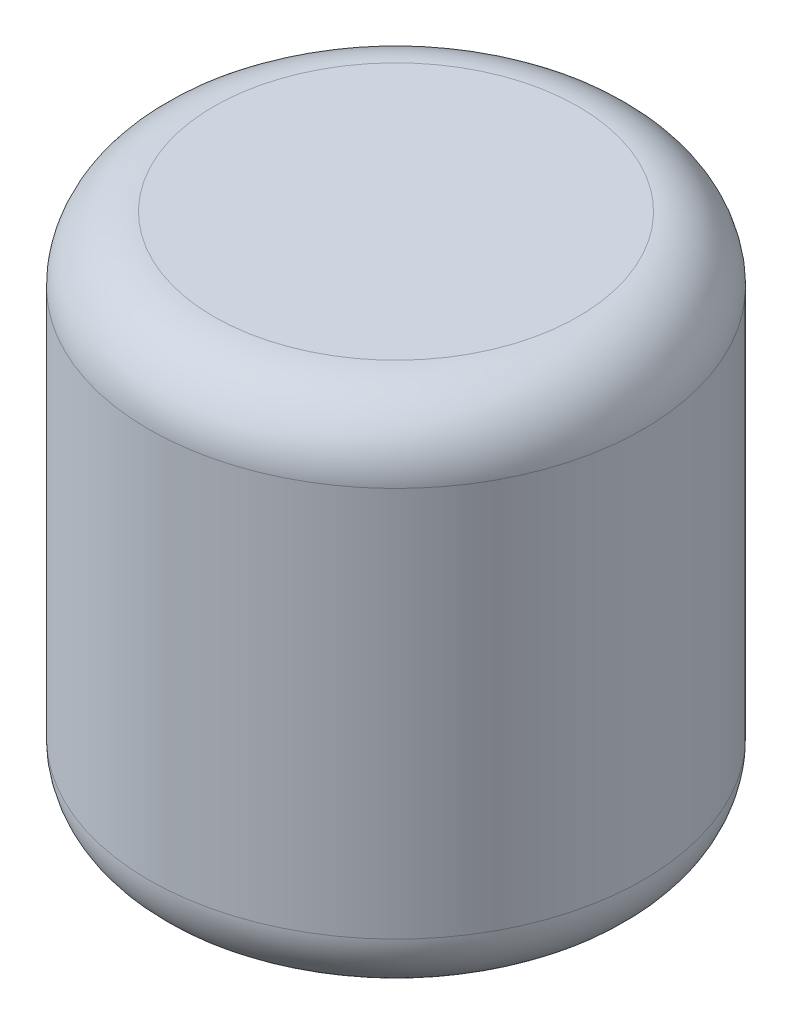
ISO-10303-21;
HEADER;
FILE_DESCRIPTION(('STEP AP214'),'2;1');
FILE_NAME('part.step','',(''),(''),'','','');
FILE_SCHEMA(('AUTOMOTIVE_DESIGN { 1 0 10303 214 1 1 1 1 }'));
ENDSEC;
DATA;
#1=APPLICATION_CONTEXT('core data for automotive mechanical design processes');
#2=APPLICATION_PROTOCOL_DEFINITION('international standard','automotive_design',2000,#1);
#3=PRODUCT_CONTEXT('',#1,'mechanical');
#4=PRODUCT('Part','Part','',(#3));
#5=PRODUCT_RELATED_PRODUCT_CATEGORY('part','',(#4));
#6=PRODUCT_DEFINITION_FORMATION('','',#4);
#7=PRODUCT_DEFINITION_CONTEXT('part definition',#1,'design');
#8=PRODUCT_DEFINITION('design','',#6,#7);
#9=PRODUCT_DEFINITION_SHAPE('','',#8);
#10=(LENGTH_UNIT() NAMED_UNIT(*) SI_UNIT(.MILLI.,.METRE.));
#11=(NAMED_UNIT(*) PLANE_ANGLE_UNIT() SI_UNIT($,.RADIAN.));
#12=(NAMED_UNIT(*) SI_UNIT($,.STERADIAN.) SOLID_ANGLE_UNIT());
#13=UNCERTAINTY_MEASURE_WITH_UNIT(LENGTH_MEASURE(1.E-05),#10,'distance_accuracy_value','');
#14=(GEOMETRIC_REPRESENTATION_CONTEXT(3) GLOBAL_UNCERTAINTY_ASSIGNED_CONTEXT((#13)) GLOBAL_UNIT_ASSIGNED_CONTEXT((#10,
#11,#12)) REPRESENTATION_CONTEXT('',''));
#15=CARTESIAN_POINT('',(0.,0.,0.));
#16=DIRECTION('',(0.,0.,1.));
#17=DIRECTION('',(1.,0.,0.));
#18=AXIS2_PLACEMENT_3D('',#15,#16,#17);
#19=CARTESIAN_POINT('',(0.,4.,0.));
#20=DIRECTION('',(0.,-1.,0.));
#21=DIRECTION('',(0.,0.,-1.));
#22=AXIS2_PLACEMENT_3D('',#19,#20,#21);
#23=CYLINDRICAL_SURFACE('',#22,1.9);
#24=CARTESIAN_POINT('',(0.,0.5,0.));
#25=DIRECTION('',(0.,1.,0.));
#26=DIRECTION('',(0.,0.,1.));
#27=AXIS2_PLACEMENT_3D('',#24,#25,#26);
#28=CIRCLE('',#27,1.9);
#29=CARTESIAN_POINT('',(0.,0.5,1.9));
#30=VERTEX_POINT('',#29);
#31=EDGE_CURVE('E42',#30,#30,#28,.T.);
#32=ORIENTED_EDGE('',*,*,#31,.T.);
#33=EDGE_LOOP('',(#32));
#34=FACE_BOUND('',#33,.T.);
#35=CARTESIAN_POINT('',(0.,3.5,0.));
#36=DIRECTION('',(0.,1.,0.));
#37=DIRECTION('',(0.,0.,1.));
#38=AXIS2_PLACEMENT_3D('',#35,#36,#37);
#39=CIRCLE('',#38,1.9);
#40=CARTESIAN_POINT('',(0.,3.5,1.9));
#41=VERTEX_POINT('',#40);
#42=EDGE_CURVE('E46',#41,#41,#39,.F.);
#43=ORIENTED_EDGE('',*,*,#42,.T.);
#44=EDGE_LOOP('',(#43));
#45=FACE_BOUND('',#44,.T.);
#46=ADVANCED_FACE('F31',(#34,#45),#23,.T.);
#47=CARTESIAN_POINT('',(0.,4.,0.));
#48=DIRECTION('',(0.,1.,0.));
#49=DIRECTION('',(0.,0.,1.));
#50=AXIS2_PLACEMENT_3D('',#47,#48,#49);
#51=PLANE('',#50);
#52=CARTESIAN_POINT('',(0.,4.,0.));
#53=DIRECTION('',(0.,1.,0.));
#54=DIRECTION('',(0.,0.,1.));
#55=AXIS2_PLACEMENT_3D('',#52,#53,#54);
#56=CIRCLE('',#55,1.4);
#57=CARTESIAN_POINT('',(0.,4.,1.4));
#58=VERTEX_POINT('',#57);
#59=EDGE_CURVE('E10',#58,#58,#56,.T.);
#60=ORIENTED_EDGE('',*,*,#59,.T.);
#61=EDGE_LOOP('',(#60));
#62=FACE_BOUND('',#61,.T.);
#63=ADVANCED_FACE('F62',(#62),#51,.T.);
#64=CARTESIAN_POINT('',(0.,0.,0.));
#65=DIRECTION('',(0.,1.,0.));
#66=DIRECTION('',(0.,0.,1.));
#67=AXIS2_PLACEMENT_3D('',#64,#65,#66);
#68=PLANE('',#67);
#69=CARTESIAN_POINT('',(0.,0.,0.));
#70=DIRECTION('',(0.,1.,0.));
#71=DIRECTION('',(0.,0.,1.));
#72=AXIS2_PLACEMENT_3D('',#69,#70,#71);
#73=CIRCLE('',#72,1.4);
#74=CARTESIAN_POINT('',(0.,0.,1.4));
#75=VERTEX_POINT('',#74);
#76=EDGE_CURVE('E38',#75,#75,#73,.F.);
#77=ORIENTED_EDGE('',*,*,#76,.T.);
#78=EDGE_LOOP('',(#77));
#79=FACE_BOUND('',#78,.T.);
#80=ADVANCED_FACE('F59',(#79),#68,.F.);
#81=CARTESIAN_POINT('',(0.,0.5,0.));
#82=DIRECTION('',(0.,1.,0.));
#83=DIRECTION('',(0.,0.,1.));
#84=AXIS2_PLACEMENT_3D('',#81,#82,#83);
#85=TOROIDAL_SURFACE('',#84,1.4,0.5);
#86=ORIENTED_EDGE('',*,*,#76,.F.);
#87=EDGE_LOOP('',(#86));
#88=FACE_BOUND('',#87,.T.);
#89=ORIENTED_EDGE('',*,*,#31,.F.);
#90=EDGE_LOOP('',(#89));
#91=FACE_BOUND('',#90,.T.);
#92=ADVANCED_FACE('F55',(#88,#91),#85,.T.);
#93=CARTESIAN_POINT('',(0.,3.5,0.));
#94=DIRECTION('',(0.,1.,0.));
#95=DIRECTION('',(0.,0.,1.));
#96=AXIS2_PLACEMENT_3D('',#93,#94,#95);
#97=TOROIDAL_SURFACE('',#96,1.4,0.5);
#98=ORIENTED_EDGE('',*,*,#42,.F.);
#99=EDGE_LOOP('',(#98));
#100=FACE_BOUND('',#99,.T.);
#101=ORIENTED_EDGE('',*,*,#59,.F.);
#102=EDGE_LOOP('',(#101));
#103=FACE_BOUND('',#102,.T.);
#104=ADVANCED_FACE('F33',(#100,#103),#97,.T.);
#105=CLOSED_SHELL('',(#46,#63,#80,#92,#104));
#106=MANIFOLD_SOLID_BREP('B2',#105);
#107=ADVANCED_BREP_SHAPE_REPRESENTATION('',(#18,#106),#14);
#108=SHAPE_DEFINITION_REPRESENTATION(#9,#107);
ENDSEC;
END-ISO-10303-21;
